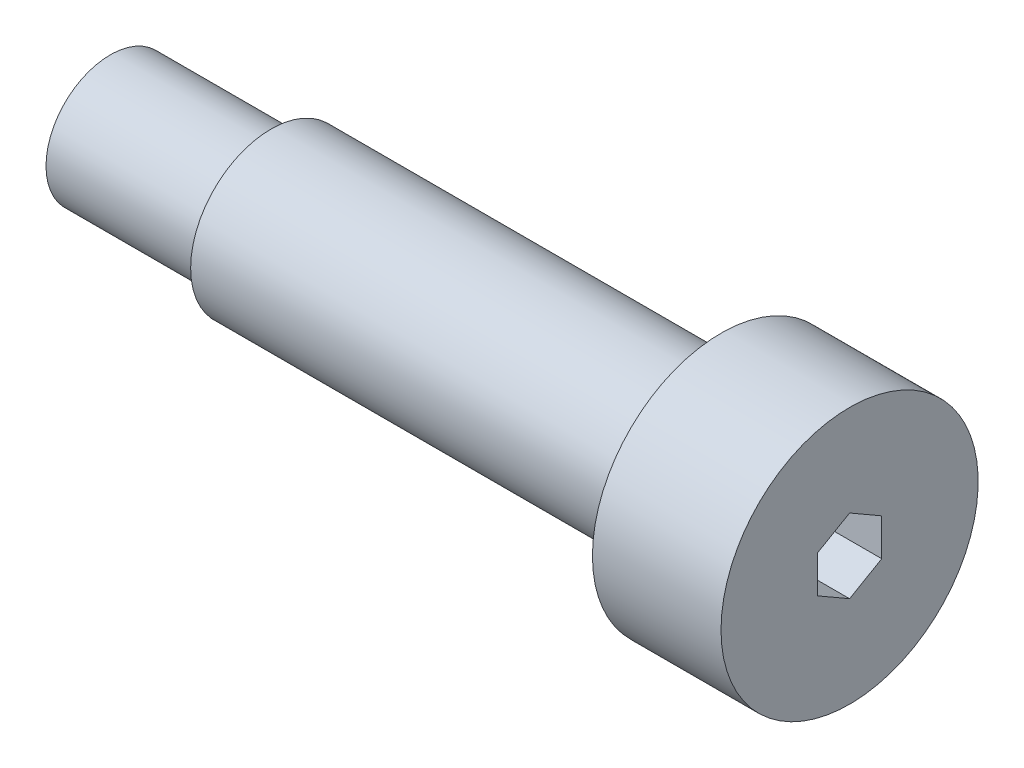
ISO-10303-21;
HEADER;
FILE_DESCRIPTION(('STEP AP214'),'2;1');
FILE_NAME('part.step','',(''),(''),'','','');
FILE_SCHEMA(('AUTOMOTIVE_DESIGN { 1 0 10303 214 1 1 1 1 }'));
ENDSEC;
DATA;
#1=APPLICATION_CONTEXT('core data for automotive mechanical design processes');
#2=APPLICATION_PROTOCOL_DEFINITION('international standard','automotive_design',2000,#1);
#3=PRODUCT_CONTEXT('',#1,'mechanical');
#4=PRODUCT('Part','Part','',(#3));
#5=PRODUCT_RELATED_PRODUCT_CATEGORY('part','',(#4));
#6=PRODUCT_DEFINITION_FORMATION('','',#4);
#7=PRODUCT_DEFINITION_CONTEXT('part definition',#1,'design');
#8=PRODUCT_DEFINITION('design','',#6,#7);
#9=PRODUCT_DEFINITION_SHAPE('','',#8);
#10=(LENGTH_UNIT() NAMED_UNIT(*) SI_UNIT(.MILLI.,.METRE.));
#11=(NAMED_UNIT(*) PLANE_ANGLE_UNIT() SI_UNIT($,.RADIAN.));
#12=(NAMED_UNIT(*) SI_UNIT($,.STERADIAN.) SOLID_ANGLE_UNIT());
#13=UNCERTAINTY_MEASURE_WITH_UNIT(LENGTH_MEASURE(1.E-05),#10,'distance_accuracy_value','');
#14=(GEOMETRIC_REPRESENTATION_CONTEXT(3) GLOBAL_UNCERTAINTY_ASSIGNED_CONTEXT((#13)) GLOBAL_UNIT_ASSIGNED_CONTEXT((#10,
#11,#12)) REPRESENTATION_CONTEXT('',''));
#15=CARTESIAN_POINT('',(0.,0.,0.));
#16=DIRECTION('',(0.,0.,1.));
#17=DIRECTION('',(1.,0.,0.));
#18=AXIS2_PLACEMENT_3D('',#15,#16,#17);
#19=CARTESIAN_POINT('',(18.,0.,0.));
#20=DIRECTION('',(-1.,0.,0.));
#21=DIRECTION('',(0.,0.,1.));
#22=AXIS2_PLACEMENT_3D('',#19,#20,#21);
#23=PLANE('',#22);
#24=DIRECTION('',(0.,-0.5,0.866025403784439));
#25=VECTOR('',#24,1.);
#26=CARTESIAN_POINT('',(18.,1.15470053837925,0.));
#27=LINE('',#26,#25);
#28=CARTESIAN_POINT('',(18.,1.15470053837925,0.));
#29=VERTEX_POINT('',#28);
#30=CARTESIAN_POINT('',(18.,0.577350269189626,1.));
#31=VERTEX_POINT('',#30);
#32=EDGE_CURVE('E125',#29,#31,#27,.T.);
#33=ORIENTED_EDGE('',*,*,#32,.F.);
#34=DIRECTION('',(0.,0.5,0.866025403784439));
#35=VECTOR('',#34,1.);
#36=CARTESIAN_POINT('',(18.,0.577350269189626,-1.));
#37=LINE('',#36,#35);
#38=CARTESIAN_POINT('',(18.,0.577350269189626,-1.));
#39=VERTEX_POINT('',#38);
#40=EDGE_CURVE('E51',#39,#29,#37,.T.);
#41=ORIENTED_EDGE('',*,*,#40,.F.);
#42=DIRECTION('',(0.,1.,0.));
#43=VECTOR('',#42,1.);
#44=CARTESIAN_POINT('',(18.,-0.577350269189626,-1.));
#45=LINE('',#44,#43);
#46=CARTESIAN_POINT('',(18.,-0.577350269189626,-1.));
#47=VERTEX_POINT('',#46);
#48=EDGE_CURVE('E134',#47,#39,#45,.T.);
#49=ORIENTED_EDGE('',*,*,#48,.F.);
#50=DIRECTION('',(0.,0.5,-0.866025403784439));
#51=VECTOR('',#50,1.);
#52=CARTESIAN_POINT('',(18.,-1.15470053837925,0.));
#53=LINE('',#52,#51);
#54=CARTESIAN_POINT('',(18.,-1.15470053837925,0.));
#55=VERTEX_POINT('',#54);
#56=EDGE_CURVE('E132',#55,#47,#53,.T.);
#57=ORIENTED_EDGE('',*,*,#56,.F.);
#58=DIRECTION('',(0.,-0.5,-0.866025403784439));
#59=VECTOR('',#58,1.);
#60=CARTESIAN_POINT('',(18.,-0.577350269189626,1.));
#61=LINE('',#60,#59);
#62=CARTESIAN_POINT('',(18.,-0.577350269189626,1.));
#63=VERTEX_POINT('',#62);
#64=EDGE_CURVE('E99',#63,#55,#61,.T.);
#65=ORIENTED_EDGE('',*,*,#64,.F.);
#66=DIRECTION('',(0.,-1.,0.));
#67=VECTOR('',#66,1.);
#68=CARTESIAN_POINT('',(18.,0.577350269189626,1.));
#69=LINE('',#68,#67);
#70=EDGE_CURVE('E128',#31,#63,#69,.T.);
#71=ORIENTED_EDGE('',*,*,#70,.F.);
#72=EDGE_LOOP('',(#33,#41,#49,#57,#65,#71));
#73=FACE_BOUND('',#72,.T.);
#74=CARTESIAN_POINT('',(18.,0.,0.));
#75=DIRECTION('',(-1.,0.,0.));
#76=DIRECTION('',(0.,0.,1.));
#77=AXIS2_PLACEMENT_3D('',#74,#75,#76);
#78=CIRCLE('',#77,4.);
#79=CARTESIAN_POINT('',(18.,0.,4.));
#80=VERTEX_POINT('',#79);
#81=EDGE_CURVE('E11',#80,#80,#78,.T.);
#82=ORIENTED_EDGE('',*,*,#81,.F.);
#83=EDGE_LOOP('',(#82));
#84=FACE_BOUND('',#83,.T.);
#85=ADVANCED_FACE('F37',(#73,#84),#23,.F.);
#86=CARTESIAN_POINT('',(0.,0.,0.));
#87=DIRECTION('',(-1.,0.,0.));
#88=DIRECTION('',(0.,0.,1.));
#89=AXIS2_PLACEMENT_3D('',#86,#87,#88);
#90=CYLINDRICAL_SURFACE('',#89,4.);
#91=CARTESIAN_POINT('',(14.,0.,0.));
#92=DIRECTION('',(-1.,0.,0.));
#93=DIRECTION('',(0.,0.,1.));
#94=AXIS2_PLACEMENT_3D('',#91,#92,#93);
#95=CIRCLE('',#94,4.);
#96=CARTESIAN_POINT('',(14.,0.,4.));
#97=VERTEX_POINT('',#96);
#98=EDGE_CURVE('E44',#97,#97,#95,.T.);
#99=ORIENTED_EDGE('',*,*,#98,.F.);
#100=EDGE_LOOP('',(#99));
#101=FACE_BOUND('',#100,.T.);
#102=ORIENTED_EDGE('',*,*,#81,.T.);
#103=EDGE_LOOP('',(#102));
#104=FACE_BOUND('',#103,.T.);
#105=ADVANCED_FACE('F159',(#101,#104),#90,.T.);
#106=CARTESIAN_POINT('',(14.,4.,0.));
#107=DIRECTION('',(1.,0.,0.));
#108=DIRECTION('',(0.,0.,-1.));
#109=AXIS2_PLACEMENT_3D('',#106,#107,#108);
#110=PLANE('',#109);
#111=CARTESIAN_POINT('',(14.,0.,0.));
#112=DIRECTION('',(-1.,0.,0.));
#113=DIRECTION('',(0.,0.,1.));
#114=AXIS2_PLACEMENT_3D('',#111,#112,#113);
#115=CIRCLE('',#114,2.5);
#116=CARTESIAN_POINT('',(14.,0.,2.5));
#117=VERTEX_POINT('',#116);
#118=EDGE_CURVE('E152',#117,#117,#115,.T.);
#119=ORIENTED_EDGE('',*,*,#118,.F.);
#120=EDGE_LOOP('',(#119));
#121=FACE_BOUND('',#120,.T.);
#122=ORIENTED_EDGE('',*,*,#98,.T.);
#123=EDGE_LOOP('',(#122));
#124=FACE_BOUND('',#123,.T.);
#125=ADVANCED_FACE('F157',(#121,#124),#110,.F.);
#126=CARTESIAN_POINT('',(0.,0.,0.));
#127=DIRECTION('',(-1.,0.,0.));
#128=DIRECTION('',(0.,0.,1.));
#129=AXIS2_PLACEMENT_3D('',#126,#127,#128);
#130=CYLINDRICAL_SURFACE('',#129,2.5);
#131=CARTESIAN_POINT('',(0.,0.,0.));
#132=DIRECTION('',(-1.,0.,0.));
#133=DIRECTION('',(0.,0.,1.));
#134=AXIS2_PLACEMENT_3D('',#131,#132,#133);
#135=CIRCLE('',#134,2.5);
#136=CARTESIAN_POINT('',(0.,0.,2.5));
#137=VERTEX_POINT('',#136);
#138=EDGE_CURVE('E149',#137,#137,#135,.T.);
#139=ORIENTED_EDGE('',*,*,#138,.F.);
#140=EDGE_LOOP('',(#139));
#141=FACE_BOUND('',#140,.T.);
#142=ORIENTED_EDGE('',*,*,#118,.T.);
#143=EDGE_LOOP('',(#142));
#144=FACE_BOUND('',#143,.T.);
#145=ADVANCED_FACE('F196',(#141,#144),#130,.T.);
#146=CARTESIAN_POINT('',(0.,2.5,0.));
#147=DIRECTION('',(1.,0.,0.));
#148=DIRECTION('',(0.,0.,-1.));
#149=AXIS2_PLACEMENT_3D('',#146,#147,#148);
#150=PLANE('',#149);
#151=CARTESIAN_POINT('',(0.,0.,0.));
#152=DIRECTION('',(-1.,0.,0.));
#153=DIRECTION('',(0.,0.,1.));
#154=AXIS2_PLACEMENT_3D('',#151,#152,#153);
#155=CIRCLE('',#154,2.);
#156=CARTESIAN_POINT('',(0.,0.,2.));
#157=VERTEX_POINT('',#156);
#158=EDGE_CURVE('E146',#157,#157,#155,.T.);
#159=ORIENTED_EDGE('',*,*,#158,.F.);
#160=EDGE_LOOP('',(#159));
#161=FACE_BOUND('',#160,.T.);
#162=ORIENTED_EDGE('',*,*,#138,.T.);
#163=EDGE_LOOP('',(#162));
#164=FACE_BOUND('',#163,.T.);
#165=ADVANCED_FACE('F192',(#161,#164),#150,.F.);
#166=CARTESIAN_POINT('',(0.,0.,0.));
#167=DIRECTION('',(-1.,0.,0.));
#168=DIRECTION('',(0.,0.,1.));
#169=AXIS2_PLACEMENT_3D('',#166,#167,#168);
#170=CYLINDRICAL_SURFACE('',#169,2.);
#171=CARTESIAN_POINT('',(-5.,0.,0.));
#172=DIRECTION('',(-1.,0.,0.));
#173=DIRECTION('',(0.,0.,1.));
#174=AXIS2_PLACEMENT_3D('',#171,#172,#173);
#175=CIRCLE('',#174,2.);
#176=CARTESIAN_POINT('',(-5.,0.,2.));
#177=VERTEX_POINT('',#176);
#178=EDGE_CURVE('E138',#177,#177,#175,.T.);
#179=ORIENTED_EDGE('',*,*,#178,.F.);
#180=EDGE_LOOP('',(#179));
#181=FACE_BOUND('',#180,.T.);
#182=ORIENTED_EDGE('',*,*,#158,.T.);
#183=EDGE_LOOP('',(#182));
#184=FACE_BOUND('',#183,.T.);
#185=ADVANCED_FACE('F184',(#181,#184),#170,.T.);
#186=CARTESIAN_POINT('',(-5.,2.,0.));
#187=DIRECTION('',(1.,0.,0.));
#188=DIRECTION('',(0.,0.,-1.));
#189=AXIS2_PLACEMENT_3D('',#186,#187,#188);
#190=PLANE('',#189);
#191=ORIENTED_EDGE('',*,*,#178,.T.);
#192=EDGE_LOOP('',(#191));
#193=FACE_BOUND('',#192,.T.);
#194=ADVANCED_FACE('F177',(#193),#190,.F.);
#195=CARTESIAN_POINT('',(16.,0.577350269189626,-1.));
#196=DIRECTION('',(0.,0.866025403784439,-0.5));
#197=DIRECTION('',(0.,0.5,0.866025403784439));
#198=AXIS2_PLACEMENT_3D('',#195,#196,#197);
#199=PLANE('',#198);
#200=ORIENTED_EDGE('',*,*,#40,.T.);
#201=DIRECTION('',(1.,0.,0.));
#202=VECTOR('',#201,1.);
#203=CARTESIAN_POINT('',(16.,1.15470053837925,0.));
#204=LINE('',#203,#202);
#205=CARTESIAN_POINT('',(16.,1.15470053837925,0.));
#206=VERTEX_POINT('',#205);
#207=EDGE_CURVE('E81',#206,#29,#204,.T.);
#208=ORIENTED_EDGE('',*,*,#207,.F.);
#209=DIRECTION('',(0.,0.5,0.866025403784439));
#210=VECTOR('',#209,1.);
#211=CARTESIAN_POINT('',(16.,0.577350269189626,-1.));
#212=LINE('',#211,#210);
#213=CARTESIAN_POINT('',(16.,0.577350269189626,-1.));
#214=VERTEX_POINT('',#213);
#215=EDGE_CURVE('E136',#214,#206,#212,.T.);
#216=ORIENTED_EDGE('',*,*,#215,.F.);
#217=DIRECTION('',(1.,0.,0.));
#218=VECTOR('',#217,1.);
#219=CARTESIAN_POINT('',(16.,0.577350269189626,-1.));
#220=LINE('',#219,#218);
#221=EDGE_CURVE('E59',#214,#39,#220,.T.);
#222=ORIENTED_EDGE('',*,*,#221,.T.);
#223=EDGE_LOOP('',(#200,#208,#216,#222));
#224=FACE_BOUND('',#223,.T.);
#225=ADVANCED_FACE('F174',(#224),#199,.F.);
#226=CARTESIAN_POINT('',(16.,-0.577350269189626,-1.));
#227=DIRECTION('',(0.,0.,-1.));
#228=DIRECTION('',(-1.,0.,0.));
#229=AXIS2_PLACEMENT_3D('',#226,#227,#228);
#230=PLANE('',#229);
#231=ORIENTED_EDGE('',*,*,#48,.T.);
#232=ORIENTED_EDGE('',*,*,#221,.F.);
#233=DIRECTION('',(0.,1.,0.));
#234=VECTOR('',#233,1.);
#235=CARTESIAN_POINT('',(16.,-0.577350269189626,-1.));
#236=LINE('',#235,#234);
#237=CARTESIAN_POINT('',(16.,-0.577350269189626,-1.));
#238=VERTEX_POINT('',#237);
#239=EDGE_CURVE('E111',#238,#214,#236,.T.);
#240=ORIENTED_EDGE('',*,*,#239,.F.);
#241=DIRECTION('',(1.,0.,0.));
#242=VECTOR('',#241,1.);
#243=CARTESIAN_POINT('',(16.,-0.577350269189626,-1.));
#244=LINE('',#243,#242);
#245=EDGE_CURVE('E103',#238,#47,#244,.T.);
#246=ORIENTED_EDGE('',*,*,#245,.T.);
#247=EDGE_LOOP('',(#231,#232,#240,#246));
#248=FACE_BOUND('',#247,.T.);
#249=ADVANCED_FACE('F176',(#248),#230,.F.);
#250=CARTESIAN_POINT('',(16.,-1.15470053837925,0.));
#251=DIRECTION('',(0.,-0.866025403784439,-0.5));
#252=DIRECTION('',(0.,0.5,-0.866025403784439));
#253=AXIS2_PLACEMENT_3D('',#250,#251,#252);
#254=PLANE('',#253);
#255=ORIENTED_EDGE('',*,*,#56,.T.);
#256=ORIENTED_EDGE('',*,*,#245,.F.);
#257=DIRECTION('',(0.,0.5,-0.866025403784439));
#258=VECTOR('',#257,1.);
#259=CARTESIAN_POINT('',(16.,-1.15470053837925,0.));
#260=LINE('',#259,#258);
#261=CARTESIAN_POINT('',(16.,-1.15470053837925,0.));
#262=VERTEX_POINT('',#261);
#263=EDGE_CURVE('E107',#262,#238,#260,.T.);
#264=ORIENTED_EDGE('',*,*,#263,.F.);
#265=DIRECTION('',(1.,0.,0.));
#266=VECTOR('',#265,1.);
#267=CARTESIAN_POINT('',(16.,-1.15470053837925,0.));
#268=LINE('',#267,#266);
#269=EDGE_CURVE('E92',#262,#55,#268,.T.);
#270=ORIENTED_EDGE('',*,*,#269,.T.);
#271=EDGE_LOOP('',(#255,#256,#264,#270));
#272=FACE_BOUND('',#271,.T.);
#273=ADVANCED_FACE('F108',(#272),#254,.F.);
#274=CARTESIAN_POINT('',(16.,-0.577350269189626,1.));
#275=DIRECTION('',(0.,-0.866025403784439,0.5));
#276=DIRECTION('',(0.,-0.5,-0.866025403784439));
#277=AXIS2_PLACEMENT_3D('',#274,#275,#276);
#278=PLANE('',#277);
#279=ORIENTED_EDGE('',*,*,#64,.T.);
#280=ORIENTED_EDGE('',*,*,#269,.F.);
#281=DIRECTION('',(0.,-0.5,-0.866025403784439));
#282=VECTOR('',#281,1.);
#283=CARTESIAN_POINT('',(16.,-0.577350269189626,1.));
#284=LINE('',#283,#282);
#285=CARTESIAN_POINT('',(16.,-0.577350269189626,1.));
#286=VERTEX_POINT('',#285);
#287=EDGE_CURVE('E96',#286,#262,#284,.T.);
#288=ORIENTED_EDGE('',*,*,#287,.F.);
#289=DIRECTION('',(1.,0.,0.));
#290=VECTOR('',#289,1.);
#291=CARTESIAN_POINT('',(16.,-0.577350269189626,1.));
#292=LINE('',#291,#290);
#293=EDGE_CURVE('E104',#286,#63,#292,.T.);
#294=ORIENTED_EDGE('',*,*,#293,.T.);
#295=EDGE_LOOP('',(#279,#280,#288,#294));
#296=FACE_BOUND('',#295,.T.);
#297=ADVANCED_FACE('F94',(#296),#278,.F.);
#298=CARTESIAN_POINT('',(16.,0.577350269189626,1.));
#299=DIRECTION('',(0.,0.,1.));
#300=DIRECTION('',(0.,-1.,0.));
#301=AXIS2_PLACEMENT_3D('',#298,#299,#300);
#302=PLANE('',#301);
#303=ORIENTED_EDGE('',*,*,#70,.T.);
#304=ORIENTED_EDGE('',*,*,#293,.F.);
#305=DIRECTION('',(0.,-1.,0.));
#306=VECTOR('',#305,1.);
#307=CARTESIAN_POINT('',(16.,0.577350269189626,1.));
#308=LINE('',#307,#306);
#309=CARTESIAN_POINT('',(16.,0.577350269189626,1.));
#310=VERTEX_POINT('',#309);
#311=EDGE_CURVE('E117',#310,#286,#308,.T.);
#312=ORIENTED_EDGE('',*,*,#311,.F.);
#313=DIRECTION('',(1.,0.,0.));
#314=VECTOR('',#313,1.);
#315=CARTESIAN_POINT('',(16.,0.577350269189626,1.));
#316=LINE('',#315,#314);
#317=EDGE_CURVE('E141',#310,#31,#316,.T.);
#318=ORIENTED_EDGE('',*,*,#317,.T.);
#319=EDGE_LOOP('',(#303,#304,#312,#318));
#320=FACE_BOUND('',#319,.T.);
#321=ADVANCED_FACE('F259',(#320),#302,.F.);
#322=CARTESIAN_POINT('',(16.,1.15470053837925,0.));
#323=DIRECTION('',(0.,0.866025403784439,0.5));
#324=DIRECTION('',(0.,-0.5,0.866025403784439));
#325=AXIS2_PLACEMENT_3D('',#322,#323,#324);
#326=PLANE('',#325);
#327=ORIENTED_EDGE('',*,*,#32,.T.);
#328=ORIENTED_EDGE('',*,*,#317,.F.);
#329=DIRECTION('',(0.,-0.5,0.866025403784439));
#330=VECTOR('',#329,1.);
#331=CARTESIAN_POINT('',(16.,1.15470053837925,0.));
#332=LINE('',#331,#330);
#333=EDGE_CURVE('E119',#206,#310,#332,.T.);
#334=ORIENTED_EDGE('',*,*,#333,.F.);
#335=ORIENTED_EDGE('',*,*,#207,.T.);
#336=EDGE_LOOP('',(#327,#328,#334,#335));
#337=FACE_BOUND('',#336,.T.);
#338=ADVANCED_FACE('F172',(#337),#326,.F.);
#339=CARTESIAN_POINT('',(16.,0.577350269189626,-1.));
#340=DIRECTION('',(-1.,0.,0.));
#341=DIRECTION('',(0.,0.,1.));
#342=AXIS2_PLACEMENT_3D('',#339,#340,#341);
#343=PLANE('',#342);
#344=ORIENTED_EDGE('',*,*,#215,.T.);
#345=ORIENTED_EDGE('',*,*,#333,.T.);
#346=ORIENTED_EDGE('',*,*,#311,.T.);
#347=ORIENTED_EDGE('',*,*,#287,.T.);
#348=ORIENTED_EDGE('',*,*,#263,.T.);
#349=ORIENTED_EDGE('',*,*,#239,.T.);
#350=EDGE_LOOP('',(#344,#345,#346,#347,#348,#349));
#351=FACE_BOUND('',#350,.T.);
#352=ADVANCED_FACE('F114',(#351),#343,.F.);
#353=CLOSED_SHELL('',(#85,#105,#125,#145,#165,#185,#194,#225,#249,#273,#297,#321,#338,#352));
#354=MANIFOLD_SOLID_BREP('B2',#353);
#355=ADVANCED_BREP_SHAPE_REPRESENTATION('',(#18,#354),#14);
#356=SHAPE_DEFINITION_REPRESENTATION(#9,#355);
ENDSEC;
END-ISO-10303-21;
